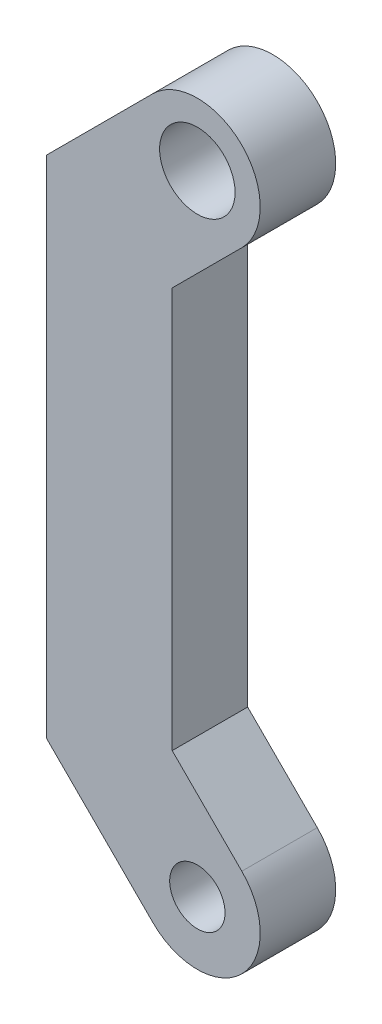
ISO-10303-21;
HEADER;
FILE_DESCRIPTION(('STEP AP214'),'2;1');
FILE_NAME('part.step','',(''),(''),'','','');
FILE_SCHEMA(('AUTOMOTIVE_DESIGN { 1 0 10303 214 1 1 1 1 }'));
ENDSEC;
DATA;
#1=APPLICATION_CONTEXT('core data for automotive mechanical design processes');
#2=APPLICATION_PROTOCOL_DEFINITION('international standard','automotive_design',2000,#1);
#3=PRODUCT_CONTEXT('',#1,'mechanical');
#4=PRODUCT('Part','Part','',(#3));
#5=PRODUCT_RELATED_PRODUCT_CATEGORY('part','',(#4));
#6=PRODUCT_DEFINITION_FORMATION('','',#4);
#7=PRODUCT_DEFINITION_CONTEXT('part definition',#1,'design');
#8=PRODUCT_DEFINITION('design','',#6,#7);
#9=PRODUCT_DEFINITION_SHAPE('','',#8);
#10=(LENGTH_UNIT() NAMED_UNIT(*) SI_UNIT(.MILLI.,.METRE.));
#11=(NAMED_UNIT(*) PLANE_ANGLE_UNIT() SI_UNIT($,.RADIAN.));
#12=(NAMED_UNIT(*) SI_UNIT($,.STERADIAN.) SOLID_ANGLE_UNIT());
#13=UNCERTAINTY_MEASURE_WITH_UNIT(LENGTH_MEASURE(1.E-05),#10,'distance_accuracy_value','');
#14=(GEOMETRIC_REPRESENTATION_CONTEXT(3) GLOBAL_UNCERTAINTY_ASSIGNED_CONTEXT((#13)) GLOBAL_UNIT_ASSIGNED_CONTEXT((#10,
#11,#12)) REPRESENTATION_CONTEXT('',''));
#15=CARTESIAN_POINT('',(0.,0.,0.));
#16=DIRECTION('',(0.,0.,1.));
#17=DIRECTION('',(1.,0.,0.));
#18=AXIS2_PLACEMENT_3D('',#15,#16,#17);
#19=CARTESIAN_POINT('',(-10.7322330470336,10.7322330470337,3.));
#20=DIRECTION('',(-0.707106781186546,0.707106781186549,0.));
#21=DIRECTION('',(-0.707106781186549,-0.707106781186546,0.));
#22=AXIS2_PLACEMENT_3D('',#19,#20,#21);
#23=PLANE('',#22);
#24=DIRECTION('',(0.707106781186549,0.707106781186546,0.));
#25=VECTOR('',#24,1.);
#26=CARTESIAN_POINT('',(-10.7322330470336,10.7322330470337,0.));
#27=LINE('',#26,#25);
#28=CARTESIAN_POINT('',(-1.00000000000002,20.4644660940673,0.));
#29=VERTEX_POINT('',#28);
#30=CARTESIAN_POINT('',(1.76776695296637,23.2322330470336,0.));
#31=VERTEX_POINT('',#30);
#32=EDGE_CURVE('E141',#29,#31,#27,.T.);
#33=ORIENTED_EDGE('',*,*,#32,.T.);
#34=DIRECTION('',(0.,0.,-1.));
#35=VECTOR('',#34,1.);
#36=CARTESIAN_POINT('',(1.76776695296637,23.2322330470336,3.));
#37=LINE('',#36,#35);
#38=CARTESIAN_POINT('',(1.76776695296637,23.2322330470336,3.));
#39=VERTEX_POINT('',#38);
#40=EDGE_CURVE('E11',#39,#31,#37,.T.);
#41=ORIENTED_EDGE('',*,*,#40,.F.);
#42=DIRECTION('',(0.707106781186549,0.707106781186546,0.));
#43=VECTOR('',#42,1.);
#44=CARTESIAN_POINT('',(-10.7322330470336,10.7322330470337,3.));
#45=LINE('',#44,#43);
#46=CARTESIAN_POINT('',(-1.00000000000002,20.4644660940673,3.));
#47=VERTEX_POINT('',#46);
#48=EDGE_CURVE('E165',#47,#39,#45,.T.);
#49=ORIENTED_EDGE('',*,*,#48,.F.);
#50=DIRECTION('',(0.,0.,-1.));
#51=VECTOR('',#50,1.);
#52=CARTESIAN_POINT('',(-1.00000000000002,20.4644660940673,3.));
#53=LINE('',#52,#51);
#54=EDGE_CURVE('E140',#47,#29,#53,.T.);
#55=ORIENTED_EDGE('',*,*,#54,.T.);
#56=EDGE_LOOP('',(#33,#41,#49,#55));
#57=FACE_BOUND('',#56,.T.);
#58=ADVANCED_FACE('F38',(#57),#23,.F.);
#59=CARTESIAN_POINT('',(0.,25.,3.));
#60=DIRECTION('',(0.,0.,-1.));
#61=DIRECTION('',(-1.,0.,0.));
#62=AXIS2_PLACEMENT_3D('',#59,#60,#61);
#63=CYLINDRICAL_SURFACE('',#62,2.5);
#64=CARTESIAN_POINT('',(0.,25.,0.));
#65=DIRECTION('',(0.,0.,1.));
#66=DIRECTION('',(1.,0.,0.));
#67=AXIS2_PLACEMENT_3D('',#64,#65,#66);
#68=CIRCLE('',#67,2.5);
#69=CARTESIAN_POINT('',(-1.76776695296637,26.7677669529664,0.));
#70=VERTEX_POINT('',#69);
#71=EDGE_CURVE('E144',#31,#70,#68,.T.);
#72=ORIENTED_EDGE('',*,*,#71,.T.);
#73=DIRECTION('',(0.,0.,-1.));
#74=VECTOR('',#73,1.);
#75=CARTESIAN_POINT('',(-1.76776695296637,26.7677669529664,3.));
#76=LINE('',#75,#74);
#77=CARTESIAN_POINT('',(-1.76776695296637,26.7677669529664,3.));
#78=VERTEX_POINT('',#77);
#79=EDGE_CURVE('E46',#78,#70,#76,.T.);
#80=ORIENTED_EDGE('',*,*,#79,.F.);
#81=CARTESIAN_POINT('',(0.,25.,3.));
#82=DIRECTION('',(0.,0.,1.));
#83=DIRECTION('',(1.,0.,0.));
#84=AXIS2_PLACEMENT_3D('',#81,#82,#83);
#85=CIRCLE('',#84,2.5);
#86=EDGE_CURVE('E97',#39,#78,#85,.T.);
#87=ORIENTED_EDGE('',*,*,#86,.F.);
#88=ORIENTED_EDGE('',*,*,#40,.T.);
#89=EDGE_LOOP('',(#72,#80,#87,#88));
#90=FACE_BOUND('',#89,.T.);
#91=ADVANCED_FACE('F178',(#90),#63,.T.);
#92=CARTESIAN_POINT('',(-14.2677669529664,14.2677669529664,3.));
#93=DIRECTION('',(-0.707106781186546,0.707106781186548,0.));
#94=DIRECTION('',(-0.707106781186549,-0.707106781186546,0.));
#95=AXIS2_PLACEMENT_3D('',#92,#93,#94);
#96=PLANE('',#95);
#97=DIRECTION('',(0.707106781186549,0.707106781186546,0.));
#98=VECTOR('',#97,1.);
#99=CARTESIAN_POINT('',(-14.2677669529664,14.2677669529664,0.));
#100=LINE('',#99,#98);
#101=CARTESIAN_POINT('',(-6.00000000000002,22.5355339059327,0.));
#102=VERTEX_POINT('',#101);
#103=EDGE_CURVE('E147',#102,#70,#100,.T.);
#104=ORIENTED_EDGE('',*,*,#103,.F.);
#105=DIRECTION('',(0.,0.,-1.));
#106=VECTOR('',#105,1.);
#107=CARTESIAN_POINT('',(-6.00000000000002,22.5355339059327,3.));
#108=LINE('',#107,#106);
#109=CARTESIAN_POINT('',(-6.00000000000002,22.5355339059327,3.));
#110=VERTEX_POINT('',#109);
#111=EDGE_CURVE('E171',#110,#102,#108,.T.);
#112=ORIENTED_EDGE('',*,*,#111,.F.);
#113=DIRECTION('',(0.707106781186549,0.707106781186546,0.));
#114=VECTOR('',#113,1.);
#115=CARTESIAN_POINT('',(-14.2677669529664,14.2677669529664,3.));
#116=LINE('',#115,#114);
#117=EDGE_CURVE('E177',#110,#78,#116,.T.);
#118=ORIENTED_EDGE('',*,*,#117,.T.);
#119=ORIENTED_EDGE('',*,*,#79,.T.);
#120=EDGE_LOOP('',(#104,#112,#118,#119));
#121=FACE_BOUND('',#120,.T.);
#122=ADVANCED_FACE('F175',(#121),#96,.T.);
#123=CARTESIAN_POINT('',(-6.00000000000002,0.,3.));
#124=DIRECTION('',(-1.,0.,0.));
#125=DIRECTION('',(0.,0.,1.));
#126=AXIS2_PLACEMENT_3D('',#123,#124,#125);
#127=PLANE('',#126);
#128=DIRECTION('',(0.,1.,0.));
#129=VECTOR('',#128,1.);
#130=CARTESIAN_POINT('',(-6.00000000000002,0.,0.));
#131=LINE('',#130,#129);
#132=CARTESIAN_POINT('',(-6.00000000000002,2.46446609406726,0.));
#133=VERTEX_POINT('',#132);
#134=EDGE_CURVE('E150',#133,#102,#131,.T.);
#135=ORIENTED_EDGE('',*,*,#134,.F.);
#136=DIRECTION('',(0.,0.,-1.));
#137=VECTOR('',#136,1.);
#138=CARTESIAN_POINT('',(-6.00000000000002,2.46446609406726,3.));
#139=LINE('',#138,#137);
#140=CARTESIAN_POINT('',(-6.00000000000002,2.46446609406726,3.));
#141=VERTEX_POINT('',#140);
#142=EDGE_CURVE('E169',#141,#133,#139,.T.);
#143=ORIENTED_EDGE('',*,*,#142,.F.);
#144=DIRECTION('',(0.,1.,0.));
#145=VECTOR('',#144,1.);
#146=CARTESIAN_POINT('',(-6.00000000000002,0.,3.));
#147=LINE('',#146,#145);
#148=EDGE_CURVE('E189',#141,#110,#147,.T.);
#149=ORIENTED_EDGE('',*,*,#148,.T.);
#150=ORIENTED_EDGE('',*,*,#111,.T.);
#151=EDGE_LOOP('',(#135,#143,#149,#150));
#152=FACE_BOUND('',#151,.T.);
#153=ADVANCED_FACE('F187',(#152),#127,.T.);
#154=CARTESIAN_POINT('',(-1.76776695296637,-1.76776695296637,3.));
#155=DIRECTION('',(-0.707106781186546,-0.707106781186549,0.));
#156=DIRECTION('',(0.707106781186549,-0.707106781186546,0.));
#157=AXIS2_PLACEMENT_3D('',#154,#155,#156);
#158=PLANE('',#157);
#159=DIRECTION('',(-0.707106781186549,0.707106781186546,0.));
#160=VECTOR('',#159,1.);
#161=CARTESIAN_POINT('',(-1.76776695296637,-1.76776695296637,0.));
#162=LINE('',#161,#160);
#163=CARTESIAN_POINT('',(-1.76776695296637,-1.76776695296637,0.));
#164=VERTEX_POINT('',#163);
#165=EDGE_CURVE('E153',#164,#133,#162,.T.);
#166=ORIENTED_EDGE('',*,*,#165,.F.);
#167=DIRECTION('',(0.,0.,-1.));
#168=VECTOR('',#167,1.);
#169=CARTESIAN_POINT('',(-1.76776695296637,-1.76776695296637,3.));
#170=LINE('',#169,#168);
#171=CARTESIAN_POINT('',(-1.76776695296637,-1.76776695296637,3.));
#172=VERTEX_POINT('',#171);
#173=EDGE_CURVE('E126',#172,#164,#170,.T.);
#174=ORIENTED_EDGE('',*,*,#173,.F.);
#175=DIRECTION('',(-0.707106781186549,0.707106781186546,0.));
#176=VECTOR('',#175,1.);
#177=CARTESIAN_POINT('',(-1.76776695296637,-1.76776695296637,3.));
#178=LINE('',#177,#176);
#179=EDGE_CURVE('E119',#172,#141,#178,.T.);
#180=ORIENTED_EDGE('',*,*,#179,.T.);
#181=ORIENTED_EDGE('',*,*,#142,.T.);
#182=EDGE_LOOP('',(#166,#174,#180,#181));
#183=FACE_BOUND('',#182,.T.);
#184=ADVANCED_FACE('F195',(#183),#158,.T.);
#185=CARTESIAN_POINT('',(0.,0.,3.));
#186=DIRECTION('',(0.,0.,-1.));
#187=DIRECTION('',(-1.,0.,0.));
#188=AXIS2_PLACEMENT_3D('',#185,#186,#187);
#189=CYLINDRICAL_SURFACE('',#188,2.5);
#190=CARTESIAN_POINT('',(0.,0.,0.));
#191=DIRECTION('',(0.,0.,1.));
#192=DIRECTION('',(1.,0.,0.));
#193=AXIS2_PLACEMENT_3D('',#190,#191,#192);
#194=CIRCLE('',#193,2.5);
#195=CARTESIAN_POINT('',(1.76776695296636,1.76776695296637,0.));
#196=VERTEX_POINT('',#195);
#197=EDGE_CURVE('E125',#164,#196,#194,.T.);
#198=ORIENTED_EDGE('',*,*,#197,.T.);
#199=DIRECTION('',(0.,0.,-1.));
#200=VECTOR('',#199,1.);
#201=CARTESIAN_POINT('',(1.76776695296636,1.76776695296637,3.));
#202=LINE('',#201,#200);
#203=CARTESIAN_POINT('',(1.76776695296636,1.76776695296637,3.));
#204=VERTEX_POINT('',#203);
#205=EDGE_CURVE('E122',#204,#196,#202,.T.);
#206=ORIENTED_EDGE('',*,*,#205,.F.);
#207=CARTESIAN_POINT('',(0.,0.,3.));
#208=DIRECTION('',(0.,0.,1.));
#209=DIRECTION('',(1.,0.,0.));
#210=AXIS2_PLACEMENT_3D('',#207,#208,#209);
#211=CIRCLE('',#210,2.5);
#212=EDGE_CURVE('E111',#172,#204,#211,.T.);
#213=ORIENTED_EDGE('',*,*,#212,.F.);
#214=ORIENTED_EDGE('',*,*,#173,.T.);
#215=EDGE_LOOP('',(#198,#206,#213,#214));
#216=FACE_BOUND('',#215,.T.);
#217=ADVANCED_FACE('F123',(#216),#189,.T.);
#218=CARTESIAN_POINT('',(1.76776695296637,1.76776695296637,3.));
#219=DIRECTION('',(-0.707106781186546,-0.707106781186549,0.));
#220=DIRECTION('',(0.707106781186549,-0.707106781186546,0.));
#221=AXIS2_PLACEMENT_3D('',#218,#219,#220);
#222=PLANE('',#221);
#223=DIRECTION('',(-0.707106781186549,0.707106781186546,0.));
#224=VECTOR('',#223,1.);
#225=CARTESIAN_POINT('',(1.76776695296637,1.76776695296637,0.));
#226=LINE('',#225,#224);
#227=CARTESIAN_POINT('',(-1.00000000000002,4.53553390593274,0.));
#228=VERTEX_POINT('',#227);
#229=EDGE_CURVE('E83',#196,#228,#226,.T.);
#230=ORIENTED_EDGE('',*,*,#229,.T.);
#231=DIRECTION('',(0.,0.,-1.));
#232=VECTOR('',#231,1.);
#233=CARTESIAN_POINT('',(-1.00000000000002,4.53553390593274,3.));
#234=LINE('',#233,#232);
#235=CARTESIAN_POINT('',(-1.00000000000002,4.53553390593274,3.));
#236=VERTEX_POINT('',#235);
#237=EDGE_CURVE('E127',#236,#228,#234,.T.);
#238=ORIENTED_EDGE('',*,*,#237,.F.);
#239=DIRECTION('',(-0.707106781186549,0.707106781186546,0.));
#240=VECTOR('',#239,1.);
#241=CARTESIAN_POINT('',(1.76776695296637,1.76776695296637,3.));
#242=LINE('',#241,#240);
#243=EDGE_CURVE('E116',#204,#236,#242,.T.);
#244=ORIENTED_EDGE('',*,*,#243,.F.);
#245=ORIENTED_EDGE('',*,*,#205,.T.);
#246=EDGE_LOOP('',(#230,#238,#244,#245));
#247=FACE_BOUND('',#246,.T.);
#248=ADVANCED_FACE('F129',(#247),#222,.F.);
#249=CARTESIAN_POINT('',(0.,0.,3.));
#250=DIRECTION('',(0.,0.,-1.));
#251=DIRECTION('',(-1.,0.,0.));
#252=AXIS2_PLACEMENT_3D('',#249,#250,#251);
#253=CYLINDRICAL_SURFACE('',#252,1.1);
#254=CARTESIAN_POINT('',(0.,0.,3.));
#255=DIRECTION('',(0.,0.,1.));
#256=DIRECTION('',(1.,0.,0.));
#257=AXIS2_PLACEMENT_3D('',#254,#255,#256);
#258=CIRCLE('',#257,1.1);
#259=CARTESIAN_POINT('',(1.1,0.,3.));
#260=VERTEX_POINT('',#259);
#261=EDGE_CURVE('E131',#260,#260,#258,.T.);
#262=ORIENTED_EDGE('',*,*,#261,.T.);
#263=EDGE_LOOP('',(#262));
#264=FACE_BOUND('',#263,.T.);
#265=CARTESIAN_POINT('',(0.,0.,0.));
#266=DIRECTION('',(0.,0.,1.));
#267=DIRECTION('',(1.,0.,0.));
#268=AXIS2_PLACEMENT_3D('',#265,#266,#267);
#269=CIRCLE('',#268,1.1);
#270=CARTESIAN_POINT('',(1.1,0.,0.));
#271=VERTEX_POINT('',#270);
#272=EDGE_CURVE('E159',#271,#271,#269,.T.);
#273=ORIENTED_EDGE('',*,*,#272,.F.);
#274=EDGE_LOOP('',(#273));
#275=FACE_BOUND('',#274,.T.);
#276=ADVANCED_FACE('F201',(#264,#275),#253,.F.);
#277=CARTESIAN_POINT('',(-1.00000000000002,0.,3.));
#278=DIRECTION('',(-1.,0.,0.));
#279=DIRECTION('',(0.,0.,1.));
#280=AXIS2_PLACEMENT_3D('',#277,#278,#279);
#281=PLANE('',#280);
#282=DIRECTION('',(0.,1.,0.));
#283=VECTOR('',#282,1.);
#284=CARTESIAN_POINT('',(-1.00000000000002,0.,0.));
#285=LINE('',#284,#283);
#286=EDGE_CURVE('E89',#228,#29,#285,.T.);
#287=ORIENTED_EDGE('',*,*,#286,.T.);
#288=ORIENTED_EDGE('',*,*,#54,.F.);
#289=DIRECTION('',(0.,1.,0.));
#290=VECTOR('',#289,1.);
#291=CARTESIAN_POINT('',(-1.00000000000002,0.,3.));
#292=LINE('',#291,#290);
#293=EDGE_CURVE('E54',#236,#47,#292,.T.);
#294=ORIENTED_EDGE('',*,*,#293,.F.);
#295=ORIENTED_EDGE('',*,*,#237,.T.);
#296=EDGE_LOOP('',(#287,#288,#294,#295));
#297=FACE_BOUND('',#296,.T.);
#298=ADVANCED_FACE('F198',(#297),#281,.F.);
#299=CARTESIAN_POINT('',(0.,25.,3.));
#300=DIRECTION('',(0.,0.,-1.));
#301=DIRECTION('',(-1.,0.,0.));
#302=AXIS2_PLACEMENT_3D('',#299,#300,#301);
#303=CYLINDRICAL_SURFACE('',#302,1.5);
#304=CARTESIAN_POINT('',(0.,25.,3.));
#305=DIRECTION('',(0.,0.,1.));
#306=DIRECTION('',(1.,0.,0.));
#307=AXIS2_PLACEMENT_3D('',#304,#305,#306);
#308=CIRCLE('',#307,1.5);
#309=CARTESIAN_POINT('',(1.5,25.,3.));
#310=VERTEX_POINT('',#309);
#311=EDGE_CURVE('E137',#310,#310,#308,.T.);
#312=ORIENTED_EDGE('',*,*,#311,.T.);
#313=EDGE_LOOP('',(#312));
#314=FACE_BOUND('',#313,.T.);
#315=CARTESIAN_POINT('',(0.,25.,0.));
#316=DIRECTION('',(0.,0.,1.));
#317=DIRECTION('',(1.,0.,0.));
#318=AXIS2_PLACEMENT_3D('',#315,#316,#317);
#319=CIRCLE('',#318,1.5);
#320=CARTESIAN_POINT('',(1.5,25.,0.));
#321=VERTEX_POINT('',#320);
#322=EDGE_CURVE('E162',#321,#321,#319,.T.);
#323=ORIENTED_EDGE('',*,*,#322,.F.);
#324=EDGE_LOOP('',(#323));
#325=FACE_BOUND('',#324,.T.);
#326=ADVANCED_FACE('F200',(#314,#325),#303,.F.);
#327=CARTESIAN_POINT('',(0.,0.,3.));
#328=DIRECTION('',(0.,0.,1.));
#329=DIRECTION('',(1.,0.,0.));
#330=AXIS2_PLACEMENT_3D('',#327,#328,#329);
#331=PLANE('',#330);
#332=ORIENTED_EDGE('',*,*,#48,.T.);
#333=ORIENTED_EDGE('',*,*,#86,.T.);
#334=ORIENTED_EDGE('',*,*,#117,.F.);
#335=ORIENTED_EDGE('',*,*,#148,.F.);
#336=ORIENTED_EDGE('',*,*,#179,.F.);
#337=ORIENTED_EDGE('',*,*,#212,.T.);
#338=ORIENTED_EDGE('',*,*,#243,.T.);
#339=ORIENTED_EDGE('',*,*,#293,.T.);
#340=EDGE_LOOP('',(#332,#333,#334,#335,#336,#337,#338,#339));
#341=FACE_BOUND('',#340,.T.);
#342=ORIENTED_EDGE('',*,*,#261,.F.);
#343=EDGE_LOOP('',(#342));
#344=FACE_BOUND('',#343,.T.);
#345=ORIENTED_EDGE('',*,*,#311,.F.);
#346=EDGE_LOOP('',(#345));
#347=FACE_BOUND('',#346,.T.);
#348=ADVANCED_FACE('F113',(#341,#344,#347),#331,.T.);
#349=CARTESIAN_POINT('',(0.,0.,0.));
#350=DIRECTION('',(0.,0.,1.));
#351=DIRECTION('',(1.,0.,0.));
#352=AXIS2_PLACEMENT_3D('',#349,#350,#351);
#353=PLANE('',#352);
#354=ORIENTED_EDGE('',*,*,#32,.F.);
#355=ORIENTED_EDGE('',*,*,#286,.F.);
#356=ORIENTED_EDGE('',*,*,#229,.F.);
#357=ORIENTED_EDGE('',*,*,#197,.F.);
#358=ORIENTED_EDGE('',*,*,#165,.T.);
#359=ORIENTED_EDGE('',*,*,#134,.T.);
#360=ORIENTED_EDGE('',*,*,#103,.T.);
#361=ORIENTED_EDGE('',*,*,#71,.F.);
#362=EDGE_LOOP('',(#354,#355,#356,#357,#358,#359,#360,#361));
#363=FACE_BOUND('',#362,.T.);
#364=ORIENTED_EDGE('',*,*,#272,.T.);
#365=EDGE_LOOP('',(#364));
#366=FACE_BOUND('',#365,.T.);
#367=ORIENTED_EDGE('',*,*,#322,.T.);
#368=EDGE_LOOP('',(#367));
#369=FACE_BOUND('',#368,.T.);
#370=ADVANCED_FACE('F182',(#363,#366,#369),#353,.F.);
#371=CLOSED_SHELL('',(#58,#91,#122,#153,#184,#217,#248,#276,#298,#326,#348,#370));
#372=MANIFOLD_SOLID_BREP('B2',#371);
#373=ADVANCED_BREP_SHAPE_REPRESENTATION('',(#18,#372),#14);
#374=SHAPE_DEFINITION_REPRESENTATION(#9,#373);
ENDSEC;
END-ISO-10303-21;
